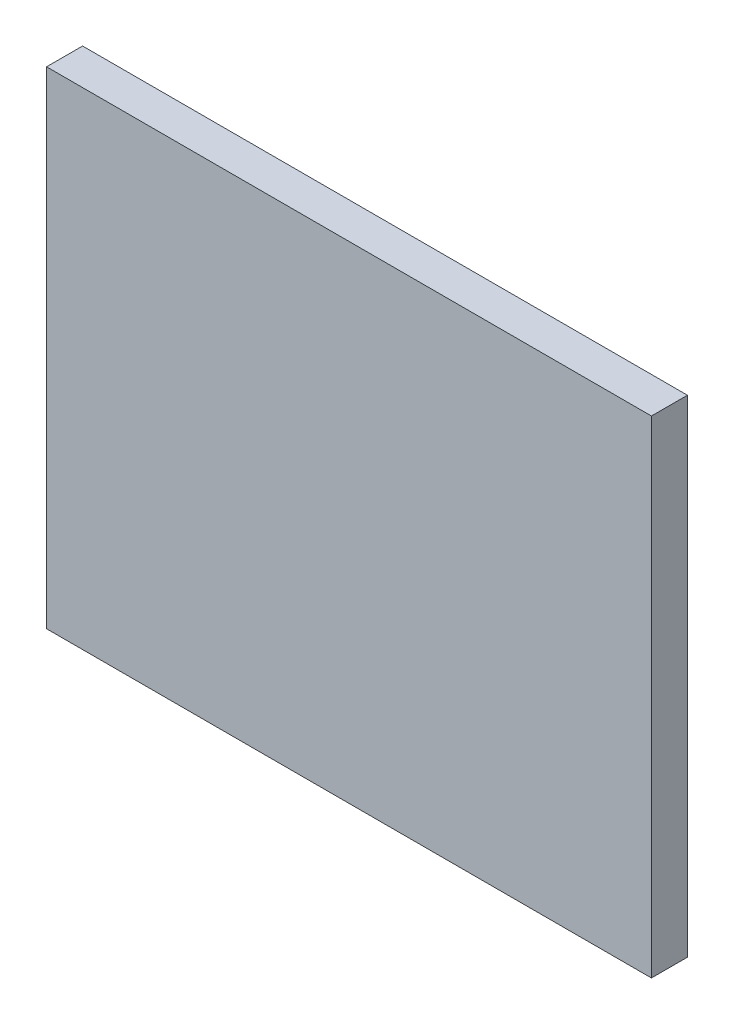
ISO-10303-21;
HEADER;
FILE_DESCRIPTION(('STEP AP214'),'2;1');
FILE_NAME('part.step','',(''),(''),'','','');
FILE_SCHEMA(('AUTOMOTIVE_DESIGN { 1 0 10303 214 1 1 1 1 }'));
ENDSEC;
DATA;
#1=APPLICATION_CONTEXT('core data for automotive mechanical design processes');
#2=APPLICATION_PROTOCOL_DEFINITION('international standard','automotive_design',2000,#1);
#3=PRODUCT_CONTEXT('',#1,'mechanical');
#4=PRODUCT('Part','Part','',(#3));
#5=PRODUCT_RELATED_PRODUCT_CATEGORY('part','',(#4));
#6=PRODUCT_DEFINITION_FORMATION('','',#4);
#7=PRODUCT_DEFINITION_CONTEXT('part definition',#1,'design');
#8=PRODUCT_DEFINITION('design','',#6,#7);
#9=PRODUCT_DEFINITION_SHAPE('','',#8);
#10=(LENGTH_UNIT() NAMED_UNIT(*) SI_UNIT(.MILLI.,.METRE.));
#11=(NAMED_UNIT(*) PLANE_ANGLE_UNIT() SI_UNIT($,.RADIAN.));
#12=(NAMED_UNIT(*) SI_UNIT($,.STERADIAN.) SOLID_ANGLE_UNIT());
#13=UNCERTAINTY_MEASURE_WITH_UNIT(LENGTH_MEASURE(1.E-05),#10,'distance_accuracy_value','');
#14=(GEOMETRIC_REPRESENTATION_CONTEXT(3) GLOBAL_UNCERTAINTY_ASSIGNED_CONTEXT((#13)) GLOBAL_UNIT_ASSIGNED_CONTEXT((#10,
#11,#12)) REPRESENTATION_CONTEXT('',''));
#15=CARTESIAN_POINT('',(0.,0.,0.));
#16=DIRECTION('',(0.,0.,1.));
#17=DIRECTION('',(1.,0.,0.));
#18=AXIS2_PLACEMENT_3D('',#15,#16,#17);
#19=CARTESIAN_POINT('',(-6.4,-5.149987299975,0.762001524003));
#20=DIRECTION('',(0.,0.,1.));
#21=DIRECTION('',(1.,0.,0.));
#22=AXIS2_PLACEMENT_3D('',#19,#20,#21);
#23=PLANE('',#22);
#24=DIRECTION('',(0.,-1.,0.));
#25=VECTOR('',#24,1.);
#26=CARTESIAN_POINT('',(6.4,1.2700025000395E-05,0.762001524003));
#27=LINE('',#26,#25);
#28=CARTESIAN_POINT('',(6.4,5.150012700025,0.762001524003));
#29=VERTEX_POINT('',#28);
#30=CARTESIAN_POINT('',(6.4,-5.149987299975,0.762001524003));
#31=VERTEX_POINT('',#30);
#32=EDGE_CURVE('E77',#29,#31,#27,.T.);
#33=ORIENTED_EDGE('',*,*,#32,.F.);
#34=DIRECTION('',(1.,0.,0.));
#35=VECTOR('',#34,1.);
#36=CARTESIAN_POINT('',(0.,5.150012700025,0.762001524003));
#37=LINE('',#36,#35);
#38=CARTESIAN_POINT('',(-6.4,5.150012700025,0.762001524003));
#39=VERTEX_POINT('',#38);
#40=EDGE_CURVE('E59',#39,#29,#37,.T.);
#41=ORIENTED_EDGE('',*,*,#40,.F.);
#42=DIRECTION('',(0.,-1.,0.));
#43=VECTOR('',#42,1.);
#44=CARTESIAN_POINT('',(-6.4,1.2700025000395E-05,0.762001524003));
#45=LINE('',#44,#43);
#46=CARTESIAN_POINT('',(-6.4,-5.149987299975,0.762001524003));
#47=VERTEX_POINT('',#46);
#48=EDGE_CURVE('E21',#39,#47,#45,.T.);
#49=ORIENTED_EDGE('',*,*,#48,.T.);
#50=DIRECTION('',(1.,0.,0.));
#51=VECTOR('',#50,1.);
#52=CARTESIAN_POINT('',(0.,-5.149987299975,0.762001524003));
#53=LINE('',#52,#51);
#54=EDGE_CURVE('E56',#47,#31,#53,.T.);
#55=ORIENTED_EDGE('',*,*,#54,.T.);
#56=EDGE_LOOP('',(#33,#41,#49,#55));
#57=FACE_BOUND('',#56,.T.);
#58=ADVANCED_FACE('F17',(#57),#23,.T.);
#59=CARTESIAN_POINT('',(-6.4,5.150012700025,0.));
#60=DIRECTION('',(1.,0.,0.));
#61=DIRECTION('',(0.,0.,1.));
#62=AXIS2_PLACEMENT_3D('',#59,#60,#61);
#63=PLANE('',#62);
#64=DIRECTION('',(0.,0.,1.));
#65=VECTOR('',#64,1.);
#66=CARTESIAN_POINT('',(-6.4,5.150012700025,0.3810007620015));
#67=LINE('',#66,#65);
#68=CARTESIAN_POINT('',(-6.4,5.150012700025,0.));
#69=VERTEX_POINT('',#68);
#70=EDGE_CURVE('E79',#69,#39,#67,.T.);
#71=ORIENTED_EDGE('',*,*,#70,.F.);
#72=DIRECTION('',(0.,-1.,0.));
#73=VECTOR('',#72,1.);
#74=CARTESIAN_POINT('',(-6.4,1.2700025000395E-05,0.));
#75=LINE('',#74,#73);
#76=CARTESIAN_POINT('',(-6.4,-5.149987299975,0.));
#77=VERTEX_POINT('',#76);
#78=EDGE_CURVE('E74',#69,#77,#75,.T.);
#79=ORIENTED_EDGE('',*,*,#78,.T.);
#80=DIRECTION('',(0.,0.,1.));
#81=VECTOR('',#80,1.);
#82=CARTESIAN_POINT('',(-6.4,-5.149987299975,0.3810007620015));
#83=LINE('',#82,#81);
#84=EDGE_CURVE('E64',#77,#47,#83,.T.);
#85=ORIENTED_EDGE('',*,*,#84,.T.);
#86=ORIENTED_EDGE('',*,*,#48,.F.);
#87=EDGE_LOOP('',(#71,#79,#85,#86));
#88=FACE_BOUND('',#87,.T.);
#89=ADVANCED_FACE('F73',(#88),#63,.F.);
#90=CARTESIAN_POINT('',(-6.4,-5.149987299975,0.));
#91=DIRECTION('',(0.,1.,0.));
#92=DIRECTION('',(0.,0.,1.));
#93=AXIS2_PLACEMENT_3D('',#90,#91,#92);
#94=PLANE('',#93);
#95=ORIENTED_EDGE('',*,*,#54,.F.);
#96=ORIENTED_EDGE('',*,*,#84,.F.);
#97=DIRECTION('',(1.,0.,0.));
#98=VECTOR('',#97,1.);
#99=CARTESIAN_POINT('',(0.,-5.149987299975,0.));
#100=LINE('',#99,#98);
#101=CARTESIAN_POINT('',(6.4,-5.149987299975,0.));
#102=VERTEX_POINT('',#101);
#103=EDGE_CURVE('E84',#77,#102,#100,.T.);
#104=ORIENTED_EDGE('',*,*,#103,.T.);
#105=DIRECTION('',(0.,0.,-1.));
#106=VECTOR('',#105,1.);
#107=CARTESIAN_POINT('',(6.4,-5.149987299975,0.3810007620015));
#108=LINE('',#107,#106);
#109=EDGE_CURVE('E70',#31,#102,#108,.T.);
#110=ORIENTED_EDGE('',*,*,#109,.F.);
#111=EDGE_LOOP('',(#95,#96,#104,#110));
#112=FACE_BOUND('',#111,.T.);
#113=ADVANCED_FACE('F67',(#112),#94,.F.);
#114=CARTESIAN_POINT('',(6.4,5.150012700025,0.));
#115=DIRECTION('',(1.,0.,0.));
#116=DIRECTION('',(0.,0.,1.));
#117=AXIS2_PLACEMENT_3D('',#114,#115,#116);
#118=PLANE('',#117);
#119=DIRECTION('',(0.,0.,-1.));
#120=VECTOR('',#119,1.);
#121=CARTESIAN_POINT('',(6.4,5.150012700025,0.3810007620015));
#122=LINE('',#121,#120);
#123=CARTESIAN_POINT('',(6.4,5.150012700025,0.));
#124=VERTEX_POINT('',#123);
#125=EDGE_CURVE('E35',#29,#124,#122,.T.);
#126=ORIENTED_EDGE('',*,*,#125,.F.);
#127=ORIENTED_EDGE('',*,*,#32,.T.);
#128=ORIENTED_EDGE('',*,*,#109,.T.);
#129=DIRECTION('',(0.,1.,0.));
#130=VECTOR('',#129,1.);
#131=CARTESIAN_POINT('',(6.4,1.2700025000395E-05,0.));
#132=LINE('',#131,#130);
#133=EDGE_CURVE('E27',#102,#124,#132,.T.);
#134=ORIENTED_EDGE('',*,*,#133,.T.);
#135=EDGE_LOOP('',(#126,#127,#128,#134));
#136=FACE_BOUND('',#135,.T.);
#137=ADVANCED_FACE('F89',(#136),#118,.T.);
#138=CARTESIAN_POINT('',(-6.4,5.150012700025,0.));
#139=DIRECTION('',(0.,1.,0.));
#140=DIRECTION('',(0.,0.,1.));
#141=AXIS2_PLACEMENT_3D('',#138,#139,#140);
#142=PLANE('',#141);
#143=ORIENTED_EDGE('',*,*,#40,.T.);
#144=ORIENTED_EDGE('',*,*,#125,.T.);
#145=DIRECTION('',(-1.,0.,0.));
#146=VECTOR('',#145,1.);
#147=CARTESIAN_POINT('',(0.,5.150012700025,0.));
#148=LINE('',#147,#146);
#149=EDGE_CURVE('E11',#124,#69,#148,.T.);
#150=ORIENTED_EDGE('',*,*,#149,.T.);
#151=ORIENTED_EDGE('',*,*,#70,.T.);
#152=EDGE_LOOP('',(#143,#144,#150,#151));
#153=FACE_BOUND('',#152,.T.);
#154=ADVANCED_FACE('F91',(#153),#142,.T.);
#155=CARTESIAN_POINT('',(-6.4,-5.149987299975,0.));
#156=DIRECTION('',(0.,0.,1.));
#157=DIRECTION('',(1.,0.,0.));
#158=AXIS2_PLACEMENT_3D('',#155,#156,#157);
#159=PLANE('',#158);
#160=ORIENTED_EDGE('',*,*,#133,.F.);
#161=ORIENTED_EDGE('',*,*,#103,.F.);
#162=ORIENTED_EDGE('',*,*,#78,.F.);
#163=ORIENTED_EDGE('',*,*,#149,.F.);
#164=EDGE_LOOP('',(#160,#161,#162,#163));
#165=FACE_BOUND('',#164,.T.);
#166=ADVANCED_FACE('F19',(#165),#159,.F.);
#167=CLOSED_SHELL('',(#58,#89,#113,#137,#154,#166));
#168=MANIFOLD_SOLID_BREP('B1',#167);
#169=ADVANCED_BREP_SHAPE_REPRESENTATION('',(#18,#168),#14);
#170=SHAPE_DEFINITION_REPRESENTATION(#9,#169);
ENDSEC;
END-ISO-10303-21;
